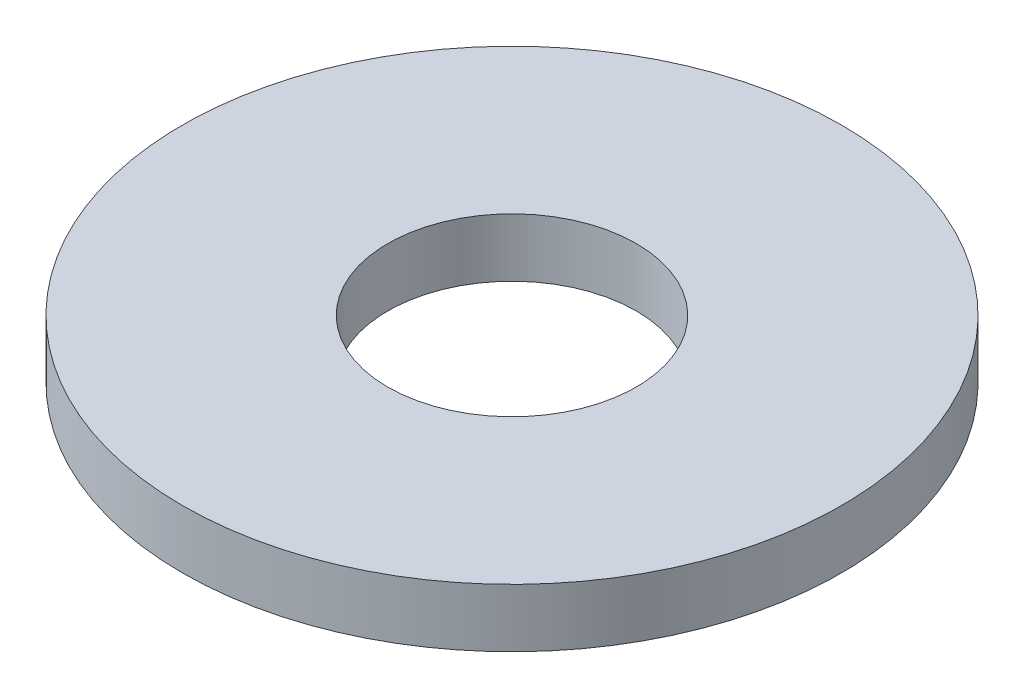
ISO-10303-21;
HEADER;
FILE_DESCRIPTION(('STEP AP214'),'2;1');
FILE_NAME('part.step','',(''),(''),'','','');
FILE_SCHEMA(('AUTOMOTIVE_DESIGN { 1 0 10303 214 1 1 1 1 }'));
ENDSEC;
DATA;
#1=APPLICATION_CONTEXT('core data for automotive mechanical design processes');
#2=APPLICATION_PROTOCOL_DEFINITION('international standard','automotive_design',2000,#1);
#3=PRODUCT_CONTEXT('',#1,'mechanical');
#4=PRODUCT('Part','Part','',(#3));
#5=PRODUCT_RELATED_PRODUCT_CATEGORY('part','',(#4));
#6=PRODUCT_DEFINITION_FORMATION('','',#4);
#7=PRODUCT_DEFINITION_CONTEXT('part definition',#1,'design');
#8=PRODUCT_DEFINITION('design','',#6,#7);
#9=PRODUCT_DEFINITION_SHAPE('','',#8);
#10=(LENGTH_UNIT() NAMED_UNIT(*) SI_UNIT(.MILLI.,.METRE.));
#11=(NAMED_UNIT(*) PLANE_ANGLE_UNIT() SI_UNIT($,.RADIAN.));
#12=(NAMED_UNIT(*) SI_UNIT($,.STERADIAN.) SOLID_ANGLE_UNIT());
#13=UNCERTAINTY_MEASURE_WITH_UNIT(LENGTH_MEASURE(1.E-05),#10,'distance_accuracy_value','');
#14=(GEOMETRIC_REPRESENTATION_CONTEXT(3) GLOBAL_UNCERTAINTY_ASSIGNED_CONTEXT((#13)) GLOBAL_UNIT_ASSIGNED_CONTEXT((#10,
#11,#12)) REPRESENTATION_CONTEXT('',''));
#15=CARTESIAN_POINT('',(0.,0.,0.));
#16=DIRECTION('',(0.,0.,1.));
#17=DIRECTION('',(1.,0.,0.));
#18=AXIS2_PLACEMENT_3D('',#15,#16,#17);
#19=CARTESIAN_POINT('',(0.,-1.5748,0.));
#20=DIRECTION('',(0.,1.,0.));
#21=DIRECTION('',(0.,0.,1.));
#22=AXIS2_PLACEMENT_3D('',#19,#20,#21);
#23=PLANE('',#22);
#24=CARTESIAN_POINT('',(0.,-1.5748,0.));
#25=DIRECTION('',(0.,-1.,0.));
#26=DIRECTION('',(0.,0.,-1.));
#27=AXIS2_PLACEMENT_3D('',#24,#25,#26);
#28=CIRCLE('',#27,8.89);
#29=CARTESIAN_POINT('',(0.,-1.5748,-8.89));
#30=VERTEX_POINT('',#29);
#31=EDGE_CURVE('E27',#30,#30,#28,.F.);
#32=ORIENTED_EDGE('',*,*,#31,.F.);
#33=EDGE_LOOP('',(#32));
#34=FACE_BOUND('',#33,.T.);
#35=CARTESIAN_POINT('',(0.,-1.5748,0.));
#36=DIRECTION('',(0.,-1.,0.));
#37=DIRECTION('',(0.,0.,-1.));
#38=AXIS2_PLACEMENT_3D('',#35,#36,#37);
#39=CIRCLE('',#38,3.3528);
#40=CARTESIAN_POINT('',(0.,-1.5748,-3.3528));
#41=VERTEX_POINT('',#40);
#42=EDGE_CURVE('E18',#41,#41,#39,.F.);
#43=ORIENTED_EDGE('',*,*,#42,.T.);
#44=EDGE_LOOP('',(#43));
#45=FACE_BOUND('',#44,.T.);
#46=ADVANCED_FACE('F15',(#34,#45),#23,.F.);
#47=CARTESIAN_POINT('',(0.,-1.5748,0.));
#48=DIRECTION('',(0.,-1.,0.));
#49=DIRECTION('',(0.,0.,-1.));
#50=AXIS2_PLACEMENT_3D('',#47,#48,#49);
#51=CYLINDRICAL_SURFACE('',#50,3.3528);
#52=CARTESIAN_POINT('',(0.,0.,0.));
#53=DIRECTION('',(0.,-1.,0.));
#54=DIRECTION('',(0.,0.,-1.));
#55=AXIS2_PLACEMENT_3D('',#52,#53,#54);
#56=CIRCLE('',#55,3.3528);
#57=CARTESIAN_POINT('',(0.,0.,-3.3528));
#58=VERTEX_POINT('',#57);
#59=EDGE_CURVE('E22',#58,#58,#56,.T.);
#60=ORIENTED_EDGE('',*,*,#59,.F.);
#61=EDGE_LOOP('',(#60));
#62=FACE_BOUND('',#61,.T.);
#63=ORIENTED_EDGE('',*,*,#42,.F.);
#64=EDGE_LOOP('',(#63));
#65=FACE_BOUND('',#64,.T.);
#66=ADVANCED_FACE('F36',(#62,#65),#51,.F.);
#67=CARTESIAN_POINT('',(0.,-1.5748,0.));
#68=DIRECTION('',(0.,-1.,0.));
#69=DIRECTION('',(0.,0.,-1.));
#70=AXIS2_PLACEMENT_3D('',#67,#68,#69);
#71=CYLINDRICAL_SURFACE('',#70,8.89);
#72=CARTESIAN_POINT('',(0.,0.,0.));
#73=DIRECTION('',(0.,-1.,0.));
#74=DIRECTION('',(0.,0.,-1.));
#75=AXIS2_PLACEMENT_3D('',#72,#73,#74);
#76=CIRCLE('',#75,8.89);
#77=CARTESIAN_POINT('',(0.,0.,-8.89));
#78=VERTEX_POINT('',#77);
#79=EDGE_CURVE('E10',#78,#78,#76,.F.);
#80=ORIENTED_EDGE('',*,*,#79,.F.);
#81=EDGE_LOOP('',(#80));
#82=FACE_BOUND('',#81,.T.);
#83=ORIENTED_EDGE('',*,*,#31,.T.);
#84=EDGE_LOOP('',(#83));
#85=FACE_BOUND('',#84,.T.);
#86=ADVANCED_FACE('F38',(#82,#85),#71,.T.);
#87=CARTESIAN_POINT('',(0.,0.,0.));
#88=DIRECTION('',(0.,1.,0.));
#89=DIRECTION('',(0.,0.,1.));
#90=AXIS2_PLACEMENT_3D('',#87,#88,#89);
#91=PLANE('',#90);
#92=ORIENTED_EDGE('',*,*,#79,.T.);
#93=EDGE_LOOP('',(#92));
#94=FACE_BOUND('',#93,.T.);
#95=ORIENTED_EDGE('',*,*,#59,.T.);
#96=EDGE_LOOP('',(#95));
#97=FACE_BOUND('',#96,.T.);
#98=ADVANCED_FACE('F45',(#94,#97),#91,.T.);
#99=CLOSED_SHELL('',(#46,#66,#86,#98));
#100=MANIFOLD_SOLID_BREP('B1',#99);
#101=ADVANCED_BREP_SHAPE_REPRESENTATION('',(#18,#100),#14);
#102=SHAPE_DEFINITION_REPRESENTATION(#9,#101);
ENDSEC;
END-ISO-10303-21;
